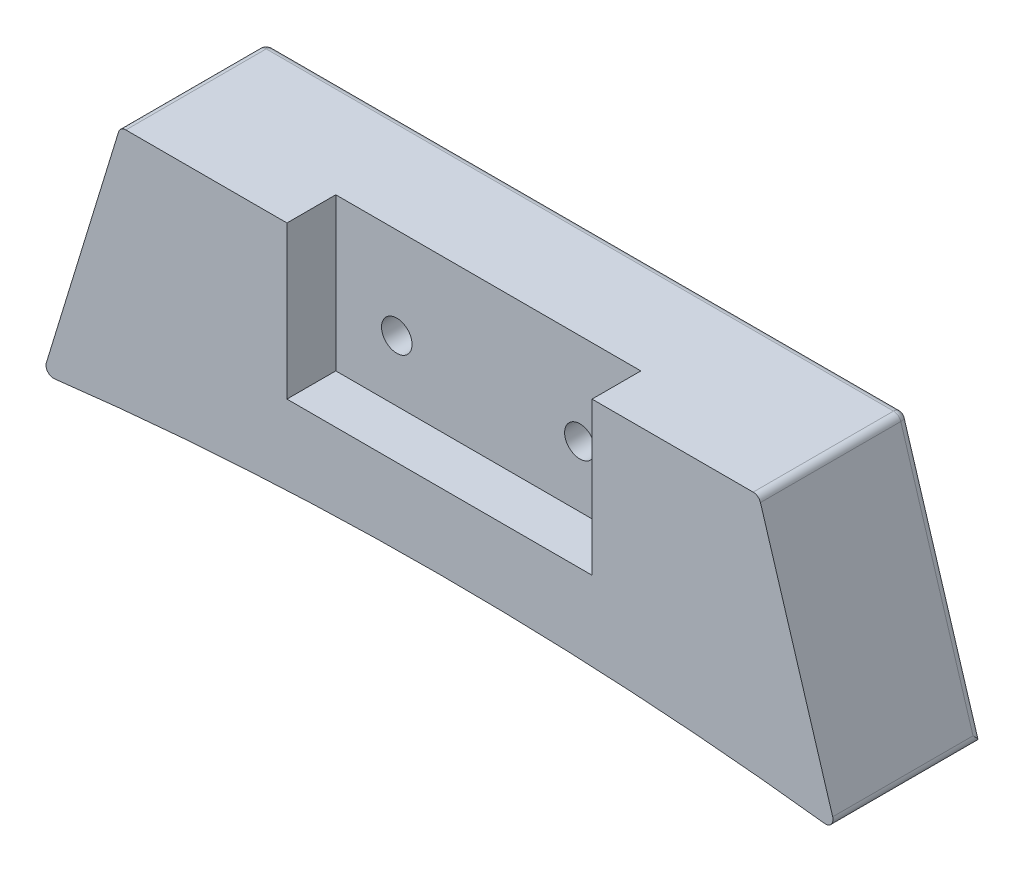
ISO-10303-21;
HEADER;
FILE_DESCRIPTION(('STEP AP214'),'2;1');
FILE_NAME('part.step','',(''),(''),'','','');
FILE_SCHEMA(('AUTOMOTIVE_DESIGN { 1 0 10303 214 1 1 1 1 }'));
ENDSEC;
DATA;
#1=APPLICATION_CONTEXT('core data for automotive mechanical design processes');
#2=APPLICATION_PROTOCOL_DEFINITION('international standard','automotive_design',2000,#1);
#3=PRODUCT_CONTEXT('',#1,'mechanical');
#4=PRODUCT('Part','Part','',(#3));
#5=PRODUCT_RELATED_PRODUCT_CATEGORY('part','',(#4));
#6=PRODUCT_DEFINITION_FORMATION('','',#4);
#7=PRODUCT_DEFINITION_CONTEXT('part definition',#1,'design');
#8=PRODUCT_DEFINITION('design','',#6,#7);
#9=PRODUCT_DEFINITION_SHAPE('','',#8);
#10=(LENGTH_UNIT() NAMED_UNIT(*) SI_UNIT(.MILLI.,.METRE.));
#11=(NAMED_UNIT(*) PLANE_ANGLE_UNIT() SI_UNIT($,.RADIAN.));
#12=(NAMED_UNIT(*) SI_UNIT($,.STERADIAN.) SOLID_ANGLE_UNIT());
#13=UNCERTAINTY_MEASURE_WITH_UNIT(LENGTH_MEASURE(1.E-05),#10,'distance_accuracy_value','');
#14=(GEOMETRIC_REPRESENTATION_CONTEXT(3) GLOBAL_UNCERTAINTY_ASSIGNED_CONTEXT((#13)) GLOBAL_UNIT_ASSIGNED_CONTEXT((#10,
#11,#12)) REPRESENTATION_CONTEXT('',''));
#15=CARTESIAN_POINT('',(0.,0.,0.));
#16=DIRECTION('',(0.,0.,1.));
#17=DIRECTION('',(1.,0.,0.));
#18=AXIS2_PLACEMENT_3D('',#15,#16,#17);
#19=CARTESIAN_POINT('',(-21.,14.9488085804668,9.7));
#20=DIRECTION('',(0.,-1.,0.));
#21=DIRECTION('',(0.,0.,-1.));
#22=AXIS2_PLACEMENT_3D('',#19,#20,#21);
#23=PLANE('',#22);
#24=DIRECTION('',(0.,0.,-1.));
#25=VECTOR('',#24,1.);
#26=CARTESIAN_POINT('',(10.,14.9488085804668,89.9765171502011));
#27=LINE('',#26,#25);
#28=CARTESIAN_POINT('',(10.,14.9488085804668,9.7));
#29=VERTEX_POINT('',#28);
#30=CARTESIAN_POINT('',(10.,14.9488085804668,6.5));
#31=VERTEX_POINT('',#30);
#32=EDGE_CURVE('E157',#29,#31,#27,.T.);
#33=ORIENTED_EDGE('',*,*,#32,.F.);
#34=DIRECTION('',(-1.,0.,0.));
#35=VECTOR('',#34,1.);
#36=CARTESIAN_POINT('',(-21.,14.9488085804668,9.7));
#37=LINE('',#36,#35);
#38=CARTESIAN_POINT('',(20.5615710719959,14.9488085804668,9.7));
#39=VERTEX_POINT('',#38);
#40=EDGE_CURVE('E178',#39,#29,#37,.T.);
#41=ORIENTED_EDGE('',*,*,#40,.F.);
#42=DIRECTION('',(0.,0.,-1.));
#43=VECTOR('',#42,1.);
#44=CARTESIAN_POINT('',(20.5615710719959,14.9488085804668,9.7));
#45=LINE('',#44,#43);
#46=CARTESIAN_POINT('',(20.5615710719959,14.9488085804668,0.5));
#47=VERTEX_POINT('',#46);
#48=EDGE_CURVE('E44',#39,#47,#45,.T.);
#49=ORIENTED_EDGE('',*,*,#48,.T.);
#50=DIRECTION('',(-1.,0.,0.));
#51=VECTOR('',#50,1.);
#52=CARTESIAN_POINT('',(-21.,14.9488085804668,0.5));
#53=LINE('',#52,#51);
#54=CARTESIAN_POINT('',(-20.5615710719959,14.9488085804668,0.5));
#55=VERTEX_POINT('',#54);
#56=EDGE_CURVE('E59',#47,#55,#53,.T.);
#57=ORIENTED_EDGE('',*,*,#56,.T.);
#58=DIRECTION('',(0.,0.,-1.));
#59=VECTOR('',#58,1.);
#60=CARTESIAN_POINT('',(-20.5615710719959,14.9488085804668,9.7));
#61=LINE('',#60,#59);
#62=CARTESIAN_POINT('',(-20.5615710719959,14.9488085804668,9.7));
#63=VERTEX_POINT('',#62);
#64=EDGE_CURVE('E11',#55,#63,#61,.F.);
#65=ORIENTED_EDGE('',*,*,#64,.T.);
#66=CARTESIAN_POINT('',(-10.,14.9488085804668,9.7));
#67=VERTEX_POINT('',#66);
#68=EDGE_CURVE('E182',#67,#63,#37,.T.);
#69=ORIENTED_EDGE('',*,*,#68,.F.);
#70=DIRECTION('',(0.,0.,-1.));
#71=VECTOR('',#70,1.);
#72=CARTESIAN_POINT('',(-10.,14.9488085804668,89.9765171502011));
#73=LINE('',#72,#71);
#74=CARTESIAN_POINT('',(-10.,14.9488085804668,6.5));
#75=VERTEX_POINT('',#74);
#76=EDGE_CURVE('E158',#67,#75,#73,.T.);
#77=ORIENTED_EDGE('',*,*,#76,.T.);
#78=DIRECTION('',(-1.,0.,0.));
#79=VECTOR('',#78,1.);
#80=CARTESIAN_POINT('',(-21.,14.9488085804668,6.5));
#81=LINE('',#80,#79);
#82=EDGE_CURVE('E143',#31,#75,#81,.T.);
#83=ORIENTED_EDGE('',*,*,#82,.F.);
#84=EDGE_LOOP('',(#33,#41,#49,#57,#65,#69,#77,#83));
#85=FACE_BOUND('',#84,.T.);
#86=ADVANCED_FACE('F35',(#85),#23,.F.);
#87=CARTESIAN_POINT('',(0.,-210.,9.7));
#88=DIRECTION('',(0.,0.,1.));
#89=DIRECTION('',(1.,0.,0.));
#90=AXIS2_PLACEMENT_3D('',#87,#88,#89);
#91=PLANE('',#90);
#92=DIRECTION('',(0.,1.,0.));
#93=VECTOR('',#92,1.);
#94=CARTESIAN_POINT('',(10.,4.94880858046681,9.7));
#95=LINE('',#94,#93);
#96=CARTESIAN_POINT('',(10.,4.94880858046681,9.7));
#97=VERTEX_POINT('',#96);
#98=EDGE_CURVE('E166',#97,#29,#95,.T.);
#99=ORIENTED_EDGE('',*,*,#98,.F.);
#100=DIRECTION('',(1.,0.,0.));
#101=VECTOR('',#100,1.);
#102=CARTESIAN_POINT('',(-10.,4.94880858046681,9.7));
#103=LINE('',#102,#101);
#104=CARTESIAN_POINT('',(-10.,4.94880858046681,9.7));
#105=VERTEX_POINT('',#104);
#106=EDGE_CURVE('E168',#105,#97,#103,.T.);
#107=ORIENTED_EDGE('',*,*,#106,.F.);
#108=DIRECTION('',(0.,-1.,0.));
#109=VECTOR('',#108,1.);
#110=CARTESIAN_POINT('',(-10.,14.9488085804668,9.7));
#111=LINE('',#110,#109);
#112=EDGE_CURVE('E155',#67,#105,#111,.T.);
#113=ORIENTED_EDGE('',*,*,#112,.F.);
#114=ORIENTED_EDGE('',*,*,#68,.T.);
#115=CARTESIAN_POINT('',(-20.5615710719959,14.4488085804668,9.7));
#116=DIRECTION('',(0.,0.,1.));
#117=DIRECTION('',(1.,0.,0.));
#118=AXIS2_PLACEMENT_3D('',#115,#116,#117);
#119=CIRCLE('',#118,0.5);
#120=CARTESIAN_POINT('',(-21.0396891500819,14.5951065756934,9.7));
#121=VERTEX_POINT('',#120);
#122=EDGE_CURVE('E210',#63,#121,#119,.T.);
#123=ORIENTED_EDGE('',*,*,#122,.T.);
#124=DIRECTION('',(-0.292595990453221,-0.956236156172051,0.));
#125=VECTOR('',#124,1.);
#126=CARTESIAN_POINT('',(-26.,-1.61573955790227,9.7));
#127=LINE('',#126,#125);
#128=CARTESIAN_POINT('',(-25.774632849654,-0.879214709285927,9.7));
#129=VERTEX_POINT('',#128);
#130=EDGE_CURVE('E171',#121,#129,#127,.T.);
#131=ORIENTED_EDGE('',*,*,#130,.T.);
#132=CARTESIAN_POINT('',(-25.296514771568,-1.02551270451254,9.7));
#133=DIRECTION('',(0.,0.,1.));
#134=DIRECTION('',(1.,0.,0.));
#135=AXIS2_PLACEMENT_3D('',#132,#133,#134);
#136=CIRCLE('',#135,0.5);
#137=CARTESIAN_POINT('',(-25.2364280381438,-1.52188915889609,9.7));
#138=VERTEX_POINT('',#137);
#139=EDGE_CURVE('E214',#129,#138,#136,.T.);
#140=ORIENTED_EDGE('',*,*,#139,.T.);
#141=CARTESIAN_POINT('',(0.,-210.,9.7));
#142=DIRECTION('',(0.,0.,-1.));
#143=DIRECTION('',(1.,0.,0.));
#144=AXIS2_PLACEMENT_3D('',#141,#142,#143);
#145=CIRCLE('',#144,210.);
#146=CARTESIAN_POINT('',(25.2364280381438,-1.52188915889609,9.7));
#147=VERTEX_POINT('',#146);
#148=EDGE_CURVE('E181',#138,#147,#145,.T.);
#149=ORIENTED_EDGE('',*,*,#148,.T.);
#150=CARTESIAN_POINT('',(25.296514771568,-1.02551270451254,9.7));
#151=DIRECTION('',(0.,0.,1.));
#152=DIRECTION('',(1.,0.,0.));
#153=AXIS2_PLACEMENT_3D('',#150,#151,#152);
#154=CIRCLE('',#153,0.5);
#155=CARTESIAN_POINT('',(25.774632849654,-0.879214709285927,9.7));
#156=VERTEX_POINT('',#155);
#157=EDGE_CURVE('E212',#147,#156,#154,.T.);
#158=ORIENTED_EDGE('',*,*,#157,.T.);
#159=DIRECTION('',(0.292595990453221,-0.956236156172051,0.));
#160=VECTOR('',#159,1.);
#161=CARTESIAN_POINT('',(26.,-1.61573955790227,9.7));
#162=LINE('',#161,#160);
#163=CARTESIAN_POINT('',(21.0396891500819,14.5951065756934,9.7));
#164=VERTEX_POINT('',#163);
#165=EDGE_CURVE('E174',#164,#156,#162,.T.);
#166=ORIENTED_EDGE('',*,*,#165,.F.);
#167=CARTESIAN_POINT('',(20.5615710719959,14.4488085804668,9.7));
#168=DIRECTION('',(0.,0.,1.));
#169=DIRECTION('',(1.,0.,0.));
#170=AXIS2_PLACEMENT_3D('',#167,#168,#169);
#171=CIRCLE('',#170,0.5);
#172=EDGE_CURVE('E208',#164,#39,#171,.T.);
#173=ORIENTED_EDGE('',*,*,#172,.T.);
#174=ORIENTED_EDGE('',*,*,#40,.T.);
#175=EDGE_LOOP('',(#99,#107,#113,#114,#123,#131,#140,#149,#158,#166,#173,#174));
#176=FACE_BOUND('',#175,.T.);
#177=ADVANCED_FACE('F293',(#176),#91,.T.);
#178=CARTESIAN_POINT('',(0.,-210.,0.));
#179=DIRECTION('',(0.,0.,1.));
#180=DIRECTION('',(1.,0.,0.));
#181=AXIS2_PLACEMENT_3D('',#178,#179,#180);
#182=PLANE('',#181);
#183=CARTESIAN_POINT('',(-6.,8.94880858046681,0.));
#184=DIRECTION('',(0.,0.,1.));
#185=DIRECTION('',(1.,0.,0.));
#186=AXIS2_PLACEMENT_3D('',#183,#184,#185);
#187=CIRCLE('',#186,1.);
#188=CARTESIAN_POINT('',(-5.,8.94880858046681,0.));
#189=VERTEX_POINT('',#188);
#190=EDGE_CURVE('E170',#189,#189,#187,.T.);
#191=ORIENTED_EDGE('',*,*,#190,.T.);
#192=EDGE_LOOP('',(#191));
#193=FACE_BOUND('',#192,.T.);
#194=CARTESIAN_POINT('',(6.,8.94880858046681,0.));
#195=DIRECTION('',(0.,0.,1.));
#196=DIRECTION('',(1.,0.,0.));
#197=AXIS2_PLACEMENT_3D('',#194,#195,#196);
#198=CIRCLE('',#197,1.);
#199=CARTESIAN_POINT('',(7.,8.94880858046681,0.));
#200=VERTEX_POINT('',#199);
#201=EDGE_CURVE('E496',#200,#200,#198,.T.);
#202=ORIENTED_EDGE('',*,*,#201,.T.);
#203=EDGE_LOOP('',(#202));
#204=FACE_BOUND('',#203,.T.);
#205=CARTESIAN_POINT('',(0.,-210.,0.));
#206=DIRECTION('',(0.,0.,-1.));
#207=DIRECTION('',(1.,0.,0.));
#208=AXIS2_PLACEMENT_3D('',#205,#206,#207);
#209=CIRCLE('',#208,210.);
#210=CARTESIAN_POINT('',(-25.2364280381438,-1.52188915889612,0.));
#211=VERTEX_POINT('',#210);
#212=CARTESIAN_POINT('',(25.2364280381438,-1.52188915889612,0.));
#213=VERTEX_POINT('',#212);
#214=EDGE_CURVE('E177',#211,#213,#209,.T.);
#215=ORIENTED_EDGE('',*,*,#214,.F.);
#216=CARTESIAN_POINT('',(-25.296514771568,-1.02551270451254,0.));
#217=DIRECTION('',(0.,0.,1.));
#218=DIRECTION('',(1.,0.,0.));
#219=AXIS2_PLACEMENT_3D('',#216,#217,#218);
#220=CIRCLE('',#219,0.5);
#221=CARTESIAN_POINT('',(-25.4428127667946,-1.50363078259856,0.));
#222=VERTEX_POINT('',#221);
#223=EDGE_CURVE('E200',#211,#222,#220,.F.);
#224=ORIENTED_EDGE('',*,*,#223,.T.);
#225=DIRECTION('',(-0.292595990453221,-0.956236156172051,0.));
#226=VECTOR('',#225,1.);
#227=CARTESIAN_POINT('',(-20.4533427983169,14.8025105852402,0.));
#228=LINE('',#227,#226);
#229=CARTESIAN_POINT('',(-20.5615710719959,14.4488085804668,0.));
#230=VERTEX_POINT('',#229);
#231=EDGE_CURVE('E196',#222,#230,#228,.F.);
#232=ORIENTED_EDGE('',*,*,#231,.T.);
#233=DIRECTION('',(-1.,0.,0.));
#234=VECTOR('',#233,1.);
#235=CARTESIAN_POINT('',(0.,14.4488085804668,0.));
#236=LINE('',#235,#234);
#237=CARTESIAN_POINT('',(20.5615710719959,14.4488085804668,0.));
#238=VERTEX_POINT('',#237);
#239=EDGE_CURVE('E192',#230,#238,#236,.F.);
#240=ORIENTED_EDGE('',*,*,#239,.T.);
#241=DIRECTION('',(0.292595990453221,-0.956236156172051,0.));
#242=VECTOR('',#241,1.);
#243=CARTESIAN_POINT('',(81.5999716953646,-185.031456000641,0.));
#244=LINE('',#243,#242);
#245=CARTESIAN_POINT('',(25.4428127667946,-1.50363078259858,0.));
#246=VERTEX_POINT('',#245);
#247=EDGE_CURVE('E194',#238,#246,#244,.T.);
#248=ORIENTED_EDGE('',*,*,#247,.T.);
#249=CARTESIAN_POINT('',(25.296514771568,-1.02551270451254,0.));
#250=DIRECTION('',(0.,0.,1.));
#251=DIRECTION('',(1.,0.,0.));
#252=AXIS2_PLACEMENT_3D('',#249,#250,#251);
#253=CIRCLE('',#252,0.5);
#254=EDGE_CURVE('E198',#246,#213,#253,.F.);
#255=ORIENTED_EDGE('',*,*,#254,.T.);
#256=EDGE_LOOP('',(#215,#224,#232,#240,#248,#255));
#257=FACE_BOUND('',#256,.T.);
#258=ADVANCED_FACE('F259',(#193,#204,#257),#182,.F.);
#259=CARTESIAN_POINT('',(0.,-210.,9.7));
#260=DIRECTION('',(0.,0.,-1.));
#261=DIRECTION('',(-1.,0.,0.));
#262=AXIS2_PLACEMENT_3D('',#259,#260,#261);
#263=CYLINDRICAL_SURFACE('',#262,210.);
#264=ORIENTED_EDGE('',*,*,#148,.F.);
#265=DIRECTION('',(0.,0.,-1.));
#266=VECTOR('',#265,1.);
#267=CARTESIAN_POINT('',(-25.2364280381438,-1.52188915889609,9.7));
#268=LINE('',#267,#266);
#269=EDGE_CURVE('E189',#138,#211,#268,.T.);
#270=ORIENTED_EDGE('',*,*,#269,.T.);
#271=ORIENTED_EDGE('',*,*,#214,.T.);
#272=DIRECTION('',(0.,0.,-1.));
#273=VECTOR('',#272,1.);
#274=CARTESIAN_POINT('',(25.2364280381438,-1.52188915889609,9.7));
#275=LINE('',#274,#273);
#276=EDGE_CURVE('E185',#213,#147,#275,.F.);
#277=ORIENTED_EDGE('',*,*,#276,.T.);
#278=EDGE_LOOP('',(#264,#270,#271,#277));
#279=FACE_BOUND('',#278,.T.);
#280=ADVANCED_FACE('F262',(#279),#263,.F.);
#281=CARTESIAN_POINT('',(26.,-1.61573955790227,0.));
#282=DIRECTION('',(-0.956236156172051,-0.292595990453221,0.));
#283=DIRECTION('',(0.292595990453221,-0.956236156172051,0.));
#284=AXIS2_PLACEMENT_3D('',#281,#282,#283);
#285=PLANE('',#284);
#286=ORIENTED_EDGE('',*,*,#165,.T.);
#287=DIRECTION('',(0.,0.,-1.));
#288=VECTOR('',#287,1.);
#289=CARTESIAN_POINT('',(25.774632849654,-0.879214709285926,0.));
#290=LINE('',#289,#288);
#291=CARTESIAN_POINT('',(25.774632849654,-0.879214709285927,0.5));
#292=VERTEX_POINT('',#291);
#293=EDGE_CURVE('E220',#156,#292,#290,.T.);
#294=ORIENTED_EDGE('',*,*,#293,.T.);
#295=DIRECTION('',(0.292595990453221,-0.956236156172051,0.));
#296=VECTOR('',#295,1.);
#297=CARTESIAN_POINT('',(26.,-1.61573955790227,0.5));
#298=LINE('',#297,#296);
#299=CARTESIAN_POINT('',(21.0396891500819,14.5951065756934,0.5));
#300=VERTEX_POINT('',#299);
#301=EDGE_CURVE('E216',#292,#300,#298,.F.);
#302=ORIENTED_EDGE('',*,*,#301,.T.);
#303=DIRECTION('',(0.,0.,-1.));
#304=VECTOR('',#303,1.);
#305=CARTESIAN_POINT('',(21.0396891500819,14.5951065756934,0.));
#306=LINE('',#305,#304);
#307=EDGE_CURVE('E218',#300,#164,#306,.F.);
#308=ORIENTED_EDGE('',*,*,#307,.T.);
#309=EDGE_LOOP('',(#286,#294,#302,#308));
#310=FACE_BOUND('',#309,.T.);
#311=ADVANCED_FACE('F290',(#310),#285,.F.);
#312=CARTESIAN_POINT('',(-26.,-1.61573955790227,0.));
#313=DIRECTION('',(-0.956236156172051,0.292595990453221,0.));
#314=DIRECTION('',(-0.292595990453221,-0.956236156172051,0.));
#315=AXIS2_PLACEMENT_3D('',#312,#313,#314);
#316=PLANE('',#315);
#317=DIRECTION('',(-0.292595990453221,-0.956236156172051,0.));
#318=VECTOR('',#317,1.);
#319=CARTESIAN_POINT('',(-26.,-1.61573955790227,0.5));
#320=LINE('',#319,#318);
#321=CARTESIAN_POINT('',(-21.0396891500819,14.5951065756934,0.5));
#322=VERTEX_POINT('',#321);
#323=CARTESIAN_POINT('',(-25.774632849654,-0.879214709285927,0.5));
#324=VERTEX_POINT('',#323);
#325=EDGE_CURVE('E202',#322,#324,#320,.T.);
#326=ORIENTED_EDGE('',*,*,#325,.T.);
#327=DIRECTION('',(0.,0.,1.));
#328=VECTOR('',#327,1.);
#329=CARTESIAN_POINT('',(-25.774632849654,-0.879214709285926,9.7));
#330=LINE('',#329,#328);
#331=EDGE_CURVE('E206',#324,#129,#330,.T.);
#332=ORIENTED_EDGE('',*,*,#331,.T.);
#333=ORIENTED_EDGE('',*,*,#130,.F.);
#334=DIRECTION('',(0.,0.,-1.));
#335=VECTOR('',#334,1.);
#336=CARTESIAN_POINT('',(-21.0396891500819,14.5951065756934,0.));
#337=LINE('',#336,#335);
#338=EDGE_CURVE('E204',#121,#322,#337,.T.);
#339=ORIENTED_EDGE('',*,*,#338,.T.);
#340=EDGE_LOOP('',(#326,#332,#333,#339));
#341=FACE_BOUND('',#340,.T.);
#342=ADVANCED_FACE('F299',(#341),#316,.T.);
#343=CARTESIAN_POINT('',(25.296514771568,-1.02551270451254,9.7));
#344=DIRECTION('',(0.,0.,-1.));
#345=DIRECTION('',(-1.,0.,0.));
#346=AXIS2_PLACEMENT_3D('',#343,#344,#345);
#347=CYLINDRICAL_SURFACE('',#346,0.5);
#348=ORIENTED_EDGE('',*,*,#276,.F.);
#349=ORIENTED_EDGE('',*,*,#254,.F.);
#350=CARTESIAN_POINT('',(25.296514771568,-1.02551270451254,0.5));
#351=DIRECTION('',(0.206896608997467,-0.676161070445015,0.707106781186547));
#352=DIRECTION('',(0.206896608997467,-0.676161070445015,-0.707106781186547));
#353=AXIS2_PLACEMENT_3D('',#350,#351,#352);
#354=ELLIPSE('',#353,0.707106781186547,0.5);
#355=EDGE_CURVE('E39',#292,#246,#354,.F.);
#356=ORIENTED_EDGE('',*,*,#355,.F.);
#357=ORIENTED_EDGE('',*,*,#293,.F.);
#358=ORIENTED_EDGE('',*,*,#157,.F.);
#359=EDGE_LOOP('',(#348,#349,#356,#357,#358));
#360=FACE_BOUND('',#359,.T.);
#361=ADVANCED_FACE('F37',(#360),#347,.T.);
#362=CARTESIAN_POINT('',(81.5999716953646,-185.031456000641,0.5));
#363=DIRECTION('',(0.292595990453221,-0.956236156172051,0.));
#364=DIRECTION('',(0.956236156172051,0.292595990453221,0.));
#365=AXIS2_PLACEMENT_3D('',#362,#363,#364);
#366=CYLINDRICAL_SURFACE('',#365,0.5);
#367=ORIENTED_EDGE('',*,*,#355,.T.);
#368=ORIENTED_EDGE('',*,*,#247,.F.);
#369=CARTESIAN_POINT('',(20.5615710719959,14.4488085804668,0.5));
#370=DIRECTION('',(-0.292595990453222,0.95623615617205,0.));
#371=DIRECTION('',(-0.956236156172051,-0.292595990453222,0.));
#372=AXIS2_PLACEMENT_3D('',#369,#370,#371);
#373=CIRCLE('',#372,0.5);
#374=EDGE_CURVE('E241',#300,#238,#373,.T.);
#375=ORIENTED_EDGE('',*,*,#374,.F.);
#376=ORIENTED_EDGE('',*,*,#301,.F.);
#377=EDGE_LOOP('',(#367,#368,#375,#376));
#378=FACE_BOUND('',#377,.T.);
#379=ADVANCED_FACE('F251',(#378),#366,.T.);
#380=CARTESIAN_POINT('',(20.5615710719959,14.4488085804668,9.7));
#381=DIRECTION('',(0.,0.,-1.));
#382=DIRECTION('',(-1.,0.,0.));
#383=AXIS2_PLACEMENT_3D('',#380,#381,#382);
#384=CYLINDRICAL_SURFACE('',#383,0.5);
#385=ORIENTED_EDGE('',*,*,#172,.F.);
#386=ORIENTED_EDGE('',*,*,#307,.F.);
#387=CARTESIAN_POINT('',(20.5615710719959,14.4488085804668,0.5));
#388=DIRECTION('',(0.,0.,-1.));
#389=DIRECTION('',(-1.,0.,0.));
#390=AXIS2_PLACEMENT_3D('',#387,#388,#389);
#391=CIRCLE('',#390,0.5);
#392=EDGE_CURVE('E239',#47,#300,#391,.T.);
#393=ORIENTED_EDGE('',*,*,#392,.F.);
#394=ORIENTED_EDGE('',*,*,#48,.F.);
#395=EDGE_LOOP('',(#385,#386,#393,#394));
#396=FACE_BOUND('',#395,.T.);
#397=ADVANCED_FACE('F287',(#396),#384,.T.);
#398=CARTESIAN_POINT('',(20.5615710719959,14.4488085804668,0.5));
#399=DIRECTION('',(0.,0.,1.));
#400=DIRECTION('',(1.,0.,0.));
#401=AXIS2_PLACEMENT_3D('',#398,#399,#400);
#402=SPHERICAL_SURFACE('',#401,0.5);
#403=ORIENTED_EDGE('',*,*,#392,.T.);
#404=ORIENTED_EDGE('',*,*,#374,.T.);
#405=CARTESIAN_POINT('',(20.5615710719959,14.4488085804668,0.5));
#406=DIRECTION('',(1.,0.,0.));
#407=DIRECTION('',(0.,0.,-1.));
#408=AXIS2_PLACEMENT_3D('',#405,#406,#407);
#409=CIRCLE('',#408,0.5);
#410=EDGE_CURVE('E236',#47,#238,#409,.F.);
#411=ORIENTED_EDGE('',*,*,#410,.F.);
#412=EDGE_LOOP('',(#403,#404,#411));
#413=FACE_BOUND('',#412,.T.);
#414=ADVANCED_FACE('F281',(#413),#402,.T.);
#415=CARTESIAN_POINT('',(-21.,14.4488085804668,0.5));
#416=DIRECTION('',(-1.,0.,0.));
#417=DIRECTION('',(0.,0.,1.));
#418=AXIS2_PLACEMENT_3D('',#415,#416,#417);
#419=CYLINDRICAL_SURFACE('',#418,0.5);
#420=ORIENTED_EDGE('',*,*,#410,.T.);
#421=ORIENTED_EDGE('',*,*,#239,.F.);
#422=CARTESIAN_POINT('',(-20.5615710719959,14.4488085804668,0.5));
#423=DIRECTION('',(-1.,0.,0.));
#424=DIRECTION('',(0.,0.,1.));
#425=AXIS2_PLACEMENT_3D('',#422,#423,#424);
#426=CIRCLE('',#425,0.5);
#427=EDGE_CURVE('E233',#55,#230,#426,.T.);
#428=ORIENTED_EDGE('',*,*,#427,.F.);
#429=ORIENTED_EDGE('',*,*,#56,.F.);
#430=EDGE_LOOP('',(#420,#421,#428,#429));
#431=FACE_BOUND('',#430,.T.);
#432=ADVANCED_FACE('F280',(#431),#419,.T.);
#433=CARTESIAN_POINT('',(-20.5615710719959,14.4488085804668,0.));
#434=DIRECTION('',(0.,0.,1.));
#435=DIRECTION('',(1.,0.,0.));
#436=AXIS2_PLACEMENT_3D('',#433,#434,#435);
#437=CYLINDRICAL_SURFACE('',#436,0.5);
#438=ORIENTED_EDGE('',*,*,#122,.F.);
#439=ORIENTED_EDGE('',*,*,#64,.F.);
#440=CARTESIAN_POINT('',(-20.5615710719959,14.4488085804668,0.5));
#441=DIRECTION('',(0.,0.,-1.));
#442=DIRECTION('',(0.,1.,0.));
#443=AXIS2_PLACEMENT_3D('',#440,#441,#442);
#444=CIRCLE('',#443,0.5);
#445=EDGE_CURVE('E230',#322,#55,#444,.T.);
#446=ORIENTED_EDGE('',*,*,#445,.F.);
#447=ORIENTED_EDGE('',*,*,#338,.F.);
#448=EDGE_LOOP('',(#438,#439,#446,#447));
#449=FACE_BOUND('',#448,.T.);
#450=ADVANCED_FACE('F301',(#449),#437,.T.);
#451=CARTESIAN_POINT('',(-20.5615710719959,14.4488085804668,0.5));
#452=DIRECTION('',(0.,0.,1.));
#453=DIRECTION('',(1.,0.,0.));
#454=AXIS2_PLACEMENT_3D('',#451,#452,#453);
#455=SPHERICAL_SURFACE('',#454,0.5);
#456=ORIENTED_EDGE('',*,*,#445,.T.);
#457=ORIENTED_EDGE('',*,*,#427,.T.);
#458=CARTESIAN_POINT('',(-20.5615710719959,14.4488085804668,0.5));
#459=DIRECTION('',(0.292595990453216,0.956236156172052,0.));
#460=DIRECTION('',(-0.956236156172052,0.292595990453216,0.));
#461=AXIS2_PLACEMENT_3D('',#458,#459,#460);
#462=CIRCLE('',#461,0.5);
#463=EDGE_CURVE('E227',#322,#230,#462,.F.);
#464=ORIENTED_EDGE('',*,*,#463,.F.);
#465=EDGE_LOOP('',(#456,#457,#464));
#466=FACE_BOUND('',#465,.T.);
#467=ADVANCED_FACE('F276',(#466),#455,.T.);
#468=CARTESIAN_POINT('',(-25.521881921914,-1.76203755312888,0.5));
#469=DIRECTION('',(0.292595990453221,0.956236156172051,0.));
#470=DIRECTION('',(-0.956236156172051,0.292595990453221,0.));
#471=AXIS2_PLACEMENT_3D('',#468,#469,#470);
#472=CYLINDRICAL_SURFACE('',#471,0.5);
#473=ORIENTED_EDGE('',*,*,#463,.T.);
#474=ORIENTED_EDGE('',*,*,#231,.F.);
#475=CARTESIAN_POINT('',(-25.296514771568,-1.02551270451254,0.5));
#476=DIRECTION('',(0.206896608997467,0.676161070445015,-0.707106781186547));
#477=DIRECTION('',(0.206896608997467,0.676161070445015,0.707106781186547));
#478=AXIS2_PLACEMENT_3D('',#475,#476,#477);
#479=ELLIPSE('',#478,0.707106781186547,0.5);
#480=EDGE_CURVE('E224',#324,#222,#479,.F.);
#481=ORIENTED_EDGE('',*,*,#480,.F.);
#482=ORIENTED_EDGE('',*,*,#325,.F.);
#483=EDGE_LOOP('',(#473,#474,#481,#482));
#484=FACE_BOUND('',#483,.T.);
#485=ADVANCED_FACE('F272',(#484),#472,.T.);
#486=CARTESIAN_POINT('',(-25.296514771568,-1.02551270451254,9.7));
#487=DIRECTION('',(0.,0.,-1.));
#488=DIRECTION('',(-1.,0.,0.));
#489=AXIS2_PLACEMENT_3D('',#486,#487,#488);
#490=CYLINDRICAL_SURFACE('',#489,0.5);
#491=ORIENTED_EDGE('',*,*,#139,.F.);
#492=ORIENTED_EDGE('',*,*,#331,.F.);
#493=ORIENTED_EDGE('',*,*,#480,.T.);
#494=ORIENTED_EDGE('',*,*,#223,.F.);
#495=ORIENTED_EDGE('',*,*,#269,.F.);
#496=EDGE_LOOP('',(#491,#492,#493,#494,#495));
#497=FACE_BOUND('',#496,.T.);
#498=ADVANCED_FACE('F266',(#497),#490,.T.);
#499=CARTESIAN_POINT('',(10.,4.94880858046681,89.9765171502011));
#500=DIRECTION('',(-1.,0.,0.));
#501=DIRECTION('',(0.,-1.,0.));
#502=AXIS2_PLACEMENT_3D('',#499,#500,#501);
#503=PLANE('',#502);
#504=DIRECTION('',(0.,0.,-1.));
#505=VECTOR('',#504,1.);
#506=CARTESIAN_POINT('',(10.,4.94880858046681,89.9765171502011));
#507=LINE('',#506,#505);
#508=CARTESIAN_POINT('',(10.,4.94880858046681,6.5));
#509=VERTEX_POINT('',#508);
#510=EDGE_CURVE('E150',#97,#509,#507,.T.);
#511=ORIENTED_EDGE('',*,*,#510,.F.);
#512=ORIENTED_EDGE('',*,*,#98,.T.);
#513=ORIENTED_EDGE('',*,*,#32,.T.);
#514=DIRECTION('',(0.,1.,0.));
#515=VECTOR('',#514,1.);
#516=CARTESIAN_POINT('',(10.,4.94880858046681,6.50000000000001));
#517=LINE('',#516,#515);
#518=EDGE_CURVE('E151',#509,#31,#517,.T.);
#519=ORIENTED_EDGE('',*,*,#518,.F.);
#520=EDGE_LOOP('',(#511,#512,#513,#519));
#521=FACE_BOUND('',#520,.T.);
#522=ADVANCED_FACE('F308',(#521),#503,.T.);
#523=CARTESIAN_POINT('',(-10.,4.94880858046681,89.9765171502011));
#524=DIRECTION('',(0.,1.,0.));
#525=DIRECTION('',(-1.,0.,0.));
#526=AXIS2_PLACEMENT_3D('',#523,#524,#525);
#527=PLANE('',#526);
#528=DIRECTION('',(0.,0.,-1.));
#529=VECTOR('',#528,1.);
#530=CARTESIAN_POINT('',(-10.,4.94880858046681,89.9765171502011));
#531=LINE('',#530,#529);
#532=CARTESIAN_POINT('',(-10.,4.94880858046681,6.5));
#533=VERTEX_POINT('',#532);
#534=EDGE_CURVE('E52',#105,#533,#531,.T.);
#535=ORIENTED_EDGE('',*,*,#534,.F.);
#536=ORIENTED_EDGE('',*,*,#106,.T.);
#537=ORIENTED_EDGE('',*,*,#510,.T.);
#538=DIRECTION('',(1.,0.,0.));
#539=VECTOR('',#538,1.);
#540=CARTESIAN_POINT('',(-10.,4.94880858046681,6.50000000000001));
#541=LINE('',#540,#539);
#542=EDGE_CURVE('E140',#533,#509,#541,.T.);
#543=ORIENTED_EDGE('',*,*,#542,.F.);
#544=EDGE_LOOP('',(#535,#536,#537,#543));
#545=FACE_BOUND('',#544,.T.);
#546=ADVANCED_FACE('F148',(#545),#527,.T.);
#547=CARTESIAN_POINT('',(-10.,14.9488085804668,89.9765171502011));
#548=DIRECTION('',(1.,0.,0.));
#549=DIRECTION('',(0.,0.,-1.));
#550=AXIS2_PLACEMENT_3D('',#547,#548,#549);
#551=PLANE('',#550);
#552=ORIENTED_EDGE('',*,*,#76,.F.);
#553=ORIENTED_EDGE('',*,*,#112,.T.);
#554=ORIENTED_EDGE('',*,*,#534,.T.);
#555=DIRECTION('',(0.,-1.,0.));
#556=VECTOR('',#555,1.);
#557=CARTESIAN_POINT('',(-10.,14.9488085804668,6.50000000000001));
#558=LINE('',#557,#556);
#559=EDGE_CURVE('E138',#75,#533,#558,.T.);
#560=ORIENTED_EDGE('',*,*,#559,.F.);
#561=EDGE_LOOP('',(#552,#553,#554,#560));
#562=FACE_BOUND('',#561,.T.);
#563=ADVANCED_FACE('F153',(#562),#551,.T.);
#564=CARTESIAN_POINT('',(0.,-210.,6.5));
#565=DIRECTION('',(0.,0.,1.));
#566=DIRECTION('',(1.,0.,0.));
#567=AXIS2_PLACEMENT_3D('',#564,#565,#566);
#568=PLANE('',#567);
#569=CARTESIAN_POINT('',(-6.,8.94880858046681,6.5));
#570=DIRECTION('',(0.,0.,1.));
#571=DIRECTION('',(1.,0.,0.));
#572=AXIS2_PLACEMENT_3D('',#569,#570,#571);
#573=CIRCLE('',#572,1.);
#574=CARTESIAN_POINT('',(-5.,8.94880858046681,6.5));
#575=VERTEX_POINT('',#574);
#576=EDGE_CURVE('E497',#575,#575,#573,.T.);
#577=ORIENTED_EDGE('',*,*,#576,.F.);
#578=EDGE_LOOP('',(#577));
#579=FACE_BOUND('',#578,.T.);
#580=CARTESIAN_POINT('',(6.,8.94880858046681,6.5));
#581=DIRECTION('',(0.,0.,1.));
#582=DIRECTION('',(1.,0.,0.));
#583=AXIS2_PLACEMENT_3D('',#580,#581,#582);
#584=CIRCLE('',#583,1.);
#585=CARTESIAN_POINT('',(7.,8.94880858046681,6.5));
#586=VERTEX_POINT('',#585);
#587=EDGE_CURVE('E498',#586,#586,#584,.T.);
#588=ORIENTED_EDGE('',*,*,#587,.F.);
#589=EDGE_LOOP('',(#588));
#590=FACE_BOUND('',#589,.T.);
#591=ORIENTED_EDGE('',*,*,#559,.T.);
#592=ORIENTED_EDGE('',*,*,#542,.T.);
#593=ORIENTED_EDGE('',*,*,#518,.T.);
#594=ORIENTED_EDGE('',*,*,#82,.T.);
#595=EDGE_LOOP('',(#591,#592,#593,#594));
#596=FACE_BOUND('',#595,.T.);
#597=ADVANCED_FACE('F139',(#579,#590,#596),#568,.T.);
#598=CARTESIAN_POINT('',(6.,8.94880858046681,0.));
#599=DIRECTION('',(0.,0.,1.));
#600=DIRECTION('',(1.,0.,0.));
#601=AXIS2_PLACEMENT_3D('',#598,#599,#600);
#602=CYLINDRICAL_SURFACE('',#601,1.);
#603=ORIENTED_EDGE('',*,*,#201,.F.);
#604=EDGE_LOOP('',(#603));
#605=FACE_BOUND('',#604,.T.);
#606=ORIENTED_EDGE('',*,*,#587,.T.);
#607=EDGE_LOOP('',(#606));
#608=FACE_BOUND('',#607,.T.);
#609=ADVANCED_FACE('F354',(#605,#608),#602,.F.);
#610=CARTESIAN_POINT('',(-6.,8.94880858046681,0.));
#611=DIRECTION('',(0.,0.,1.));
#612=DIRECTION('',(1.,0.,0.));
#613=AXIS2_PLACEMENT_3D('',#610,#611,#612);
#614=CYLINDRICAL_SURFACE('',#613,1.);
#615=ORIENTED_EDGE('',*,*,#190,.F.);
#616=EDGE_LOOP('',(#615));
#617=FACE_BOUND('',#616,.T.);
#618=ORIENTED_EDGE('',*,*,#576,.T.);
#619=EDGE_LOOP('',(#618));
#620=FACE_BOUND('',#619,.T.);
#621=ADVANCED_FACE('F373',(#617,#620),#614,.F.);
#622=CLOSED_SHELL('',(#86,#177,#258,#280,#311,#342,#361,#379,#397,#414,#432,#450,#467,#485,#498,
#522,#546,#563,#597,#609,#621));
#623=MANIFOLD_SOLID_BREP('B2',#622);
#624=ADVANCED_BREP_SHAPE_REPRESENTATION('',(#18,#623),#14);
#625=SHAPE_DEFINITION_REPRESENTATION(#9,#624);
ENDSEC;
END-ISO-10303-21;
